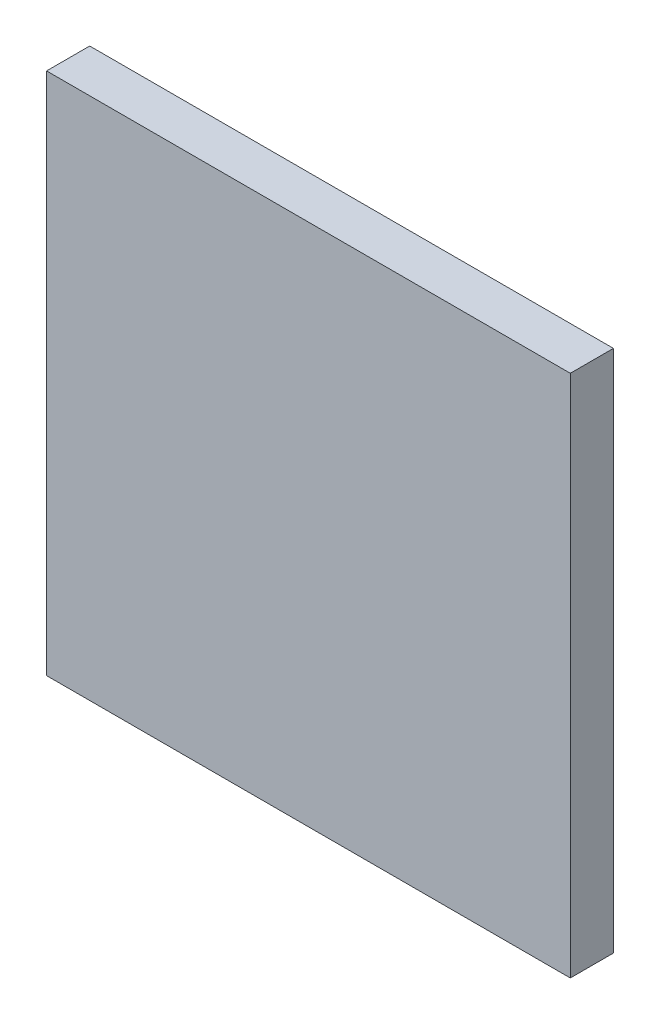
ISO-10303-21;
HEADER;
FILE_DESCRIPTION(('STEP AP214'),'2;1');
FILE_NAME('part.step','',(''),(''),'','','');
FILE_SCHEMA(('AUTOMOTIVE_DESIGN { 1 0 10303 214 1 1 1 1 }'));
ENDSEC;
DATA;
#1=APPLICATION_CONTEXT('core data for automotive mechanical design processes');
#2=APPLICATION_PROTOCOL_DEFINITION('international standard','automotive_design',2000,#1);
#3=PRODUCT_CONTEXT('',#1,'mechanical');
#4=PRODUCT('Part','Part','',(#3));
#5=PRODUCT_RELATED_PRODUCT_CATEGORY('part','',(#4));
#6=PRODUCT_DEFINITION_FORMATION('','',#4);
#7=PRODUCT_DEFINITION_CONTEXT('part definition',#1,'design');
#8=PRODUCT_DEFINITION('design','',#6,#7);
#9=PRODUCT_DEFINITION_SHAPE('','',#8);
#10=(LENGTH_UNIT() NAMED_UNIT(*) SI_UNIT(.MILLI.,.METRE.));
#11=(NAMED_UNIT(*) PLANE_ANGLE_UNIT() SI_UNIT($,.RADIAN.));
#12=(NAMED_UNIT(*) SI_UNIT($,.STERADIAN.) SOLID_ANGLE_UNIT());
#13=UNCERTAINTY_MEASURE_WITH_UNIT(LENGTH_MEASURE(1.E-05),#10,'distance_accuracy_value','');
#14=(GEOMETRIC_REPRESENTATION_CONTEXT(3) GLOBAL_UNCERTAINTY_ASSIGNED_CONTEXT((#13)) GLOBAL_UNIT_ASSIGNED_CONTEXT((#10,
#11,#12)) REPRESENTATION_CONTEXT('',''));
#15=CARTESIAN_POINT('',(0.,0.,0.));
#16=DIRECTION('',(0.,0.,1.));
#17=DIRECTION('',(1.,0.,0.));
#18=AXIS2_PLACEMENT_3D('',#15,#16,#17);
#19=CARTESIAN_POINT('',(0.,0.,-14.));
#20=DIRECTION('',(-1.,0.,0.));
#21=DIRECTION('',(0.,-1.,0.));
#22=AXIS2_PLACEMENT_3D('',#19,#20,#21);
#23=PLANE('',#22);
#24=DIRECTION('',(0.,-1.,0.));
#25=VECTOR('',#24,1.);
#26=CARTESIAN_POINT('',(0.,0.,0.));
#27=LINE('',#26,#25);
#28=CARTESIAN_POINT('',(0.,0.,0.));
#29=VERTEX_POINT('',#28);
#30=CARTESIAN_POINT('',(0.,-170.,0.));
#31=VERTEX_POINT('',#30);
#32=EDGE_CURVE('E100',#29,#31,#27,.T.);
#33=ORIENTED_EDGE('',*,*,#32,.F.);
#34=DIRECTION('',(0.,0.,1.));
#35=VECTOR('',#34,1.);
#36=CARTESIAN_POINT('',(0.,0.,-14.));
#37=LINE('',#36,#35);
#38=CARTESIAN_POINT('',(0.,0.,-14.));
#39=VERTEX_POINT('',#38);
#40=EDGE_CURVE('E11',#39,#29,#37,.T.);
#41=ORIENTED_EDGE('',*,*,#40,.F.);
#42=DIRECTION('',(0.,-1.,0.));
#43=VECTOR('',#42,1.);
#44=CARTESIAN_POINT('',(0.,0.,-14.));
#45=LINE('',#44,#43);
#46=CARTESIAN_POINT('',(0.,-170.,-14.));
#47=VERTEX_POINT('',#46);
#48=EDGE_CURVE('E94',#39,#47,#45,.T.);
#49=ORIENTED_EDGE('',*,*,#48,.T.);
#50=DIRECTION('',(0.,0.,1.));
#51=VECTOR('',#50,1.);
#52=CARTESIAN_POINT('',(0.,-170.,-14.));
#53=LINE('',#52,#51);
#54=EDGE_CURVE('E39',#47,#31,#53,.T.);
#55=ORIENTED_EDGE('',*,*,#54,.T.);
#56=EDGE_LOOP('',(#33,#41,#49,#55));
#57=FACE_BOUND('',#56,.T.);
#58=ADVANCED_FACE('F36',(#57),#23,.T.);
#59=CARTESIAN_POINT('',(0.,0.,-14.));
#60=DIRECTION('',(0.,1.,0.));
#61=DIRECTION('',(0.,0.,1.));
#62=AXIS2_PLACEMENT_3D('',#59,#60,#61);
#63=PLANE('',#62);
#64=DIRECTION('',(-1.,0.,0.));
#65=VECTOR('',#64,1.);
#66=CARTESIAN_POINT('',(0.,0.,0.));
#67=LINE('',#66,#65);
#68=CARTESIAN_POINT('',(170.,0.,0.));
#69=VERTEX_POINT('',#68);
#70=EDGE_CURVE('E96',#69,#29,#67,.T.);
#71=ORIENTED_EDGE('',*,*,#70,.F.);
#72=DIRECTION('',(0.,0.,1.));
#73=VECTOR('',#72,1.);
#74=CARTESIAN_POINT('',(170.,0.,-14.));
#75=LINE('',#74,#73);
#76=CARTESIAN_POINT('',(170.,0.,-14.));
#77=VERTEX_POINT('',#76);
#78=EDGE_CURVE('E45',#77,#69,#75,.T.);
#79=ORIENTED_EDGE('',*,*,#78,.F.);
#80=DIRECTION('',(-1.,0.,0.));
#81=VECTOR('',#80,1.);
#82=CARTESIAN_POINT('',(0.,0.,-14.));
#83=LINE('',#82,#81);
#84=EDGE_CURVE('E91',#77,#39,#83,.T.);
#85=ORIENTED_EDGE('',*,*,#84,.T.);
#86=ORIENTED_EDGE('',*,*,#40,.T.);
#87=EDGE_LOOP('',(#71,#79,#85,#86));
#88=FACE_BOUND('',#87,.T.);
#89=ADVANCED_FACE('F110',(#88),#63,.T.);
#90=CARTESIAN_POINT('',(170.,0.,-14.));
#91=DIRECTION('',(1.,0.,0.));
#92=DIRECTION('',(0.,0.,-1.));
#93=AXIS2_PLACEMENT_3D('',#90,#91,#92);
#94=PLANE('',#93);
#95=DIRECTION('',(0.,1.,0.));
#96=VECTOR('',#95,1.);
#97=CARTESIAN_POINT('',(170.,0.,0.));
#98=LINE('',#97,#96);
#99=CARTESIAN_POINT('',(170.,-170.,0.));
#100=VERTEX_POINT('',#99);
#101=EDGE_CURVE('E86',#100,#69,#98,.T.);
#102=ORIENTED_EDGE('',*,*,#101,.F.);
#103=DIRECTION('',(0.,0.,1.));
#104=VECTOR('',#103,1.);
#105=CARTESIAN_POINT('',(170.,-170.,-14.));
#106=LINE('',#105,#104);
#107=CARTESIAN_POINT('',(170.,-170.,-14.));
#108=VERTEX_POINT('',#107);
#109=EDGE_CURVE('E81',#108,#100,#106,.T.);
#110=ORIENTED_EDGE('',*,*,#109,.F.);
#111=DIRECTION('',(0.,1.,0.));
#112=VECTOR('',#111,1.);
#113=CARTESIAN_POINT('',(170.,0.,-14.));
#114=LINE('',#113,#112);
#115=EDGE_CURVE('E84',#108,#77,#114,.T.);
#116=ORIENTED_EDGE('',*,*,#115,.T.);
#117=ORIENTED_EDGE('',*,*,#78,.T.);
#118=EDGE_LOOP('',(#102,#110,#116,#117));
#119=FACE_BOUND('',#118,.T.);
#120=ADVANCED_FACE('F83',(#119),#94,.T.);
#121=CARTESIAN_POINT('',(0.,-170.,-14.));
#122=DIRECTION('',(0.,-1.,0.));
#123=DIRECTION('',(0.,0.,-1.));
#124=AXIS2_PLACEMENT_3D('',#121,#122,#123);
#125=PLANE('',#124);
#126=DIRECTION('',(1.,0.,0.));
#127=VECTOR('',#126,1.);
#128=CARTESIAN_POINT('',(0.,-170.,0.));
#129=LINE('',#128,#127);
#130=EDGE_CURVE('E103',#31,#100,#129,.T.);
#131=ORIENTED_EDGE('',*,*,#130,.F.);
#132=ORIENTED_EDGE('',*,*,#54,.F.);
#133=DIRECTION('',(1.,0.,0.));
#134=VECTOR('',#133,1.);
#135=CARTESIAN_POINT('',(0.,-170.,-14.));
#136=LINE('',#135,#134);
#137=EDGE_CURVE('E90',#47,#108,#136,.T.);
#138=ORIENTED_EDGE('',*,*,#137,.T.);
#139=ORIENTED_EDGE('',*,*,#109,.T.);
#140=EDGE_LOOP('',(#131,#132,#138,#139));
#141=FACE_BOUND('',#140,.T.);
#142=ADVANCED_FACE('F93',(#141),#125,.T.);
#143=CARTESIAN_POINT('',(0.,0.,-14.));
#144=DIRECTION('',(0.,0.,1.));
#145=DIRECTION('',(1.,0.,0.));
#146=AXIS2_PLACEMENT_3D('',#143,#144,#145);
#147=PLANE('',#146);
#148=ORIENTED_EDGE('',*,*,#48,.F.);
#149=ORIENTED_EDGE('',*,*,#84,.F.);
#150=ORIENTED_EDGE('',*,*,#115,.F.);
#151=ORIENTED_EDGE('',*,*,#137,.F.);
#152=EDGE_LOOP('',(#148,#149,#150,#151));
#153=FACE_BOUND('',#152,.T.);
#154=ADVANCED_FACE('F89',(#153),#147,.F.);
#155=CARTESIAN_POINT('',(0.,0.,0.));
#156=DIRECTION('',(0.,0.,1.));
#157=DIRECTION('',(1.,0.,0.));
#158=AXIS2_PLACEMENT_3D('',#155,#156,#157);
#159=PLANE('',#158);
#160=ORIENTED_EDGE('',*,*,#32,.T.);
#161=ORIENTED_EDGE('',*,*,#130,.T.);
#162=ORIENTED_EDGE('',*,*,#101,.T.);
#163=ORIENTED_EDGE('',*,*,#70,.T.);
#164=EDGE_LOOP('',(#160,#161,#162,#163));
#165=FACE_BOUND('',#164,.T.);
#166=ADVANCED_FACE('F109',(#165),#159,.T.);
#167=CLOSED_SHELL('',(#58,#89,#120,#142,#154,#166));
#168=MANIFOLD_SOLID_BREP('B2',#167);
#169=ADVANCED_BREP_SHAPE_REPRESENTATION('',(#18,#168),#14);
#170=SHAPE_DEFINITION_REPRESENTATION(#9,#169);
ENDSEC;
END-ISO-10303-21;
